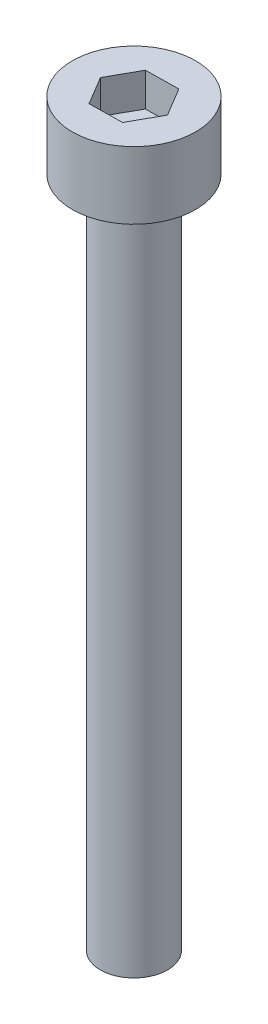
ISO-10303-21;
HEADER;
FILE_DESCRIPTION(('STEP AP214'),'2;1');
FILE_NAME('part.step','',(''),(''),'','','');
FILE_SCHEMA(('AUTOMOTIVE_DESIGN { 1 0 10303 214 1 1 1 1 }'));
ENDSEC;
DATA;
#1=APPLICATION_CONTEXT('core data for automotive mechanical design processes');
#2=APPLICATION_PROTOCOL_DEFINITION('international standard','automotive_design',2000,#1);
#3=PRODUCT_CONTEXT('',#1,'mechanical');
#4=PRODUCT('Part','Part','',(#3));
#5=PRODUCT_RELATED_PRODUCT_CATEGORY('part','',(#4));
#6=PRODUCT_DEFINITION_FORMATION('','',#4);
#7=PRODUCT_DEFINITION_CONTEXT('part definition',#1,'design');
#8=PRODUCT_DEFINITION('design','',#6,#7);
#9=PRODUCT_DEFINITION_SHAPE('','',#8);
#10=(LENGTH_UNIT() NAMED_UNIT(*) SI_UNIT(.MILLI.,.METRE.));
#11=(NAMED_UNIT(*) PLANE_ANGLE_UNIT() SI_UNIT($,.RADIAN.));
#12=(NAMED_UNIT(*) SI_UNIT($,.STERADIAN.) SOLID_ANGLE_UNIT());
#13=UNCERTAINTY_MEASURE_WITH_UNIT(LENGTH_MEASURE(1.E-05),#10,'distance_accuracy_value','');
#14=(GEOMETRIC_REPRESENTATION_CONTEXT(3) GLOBAL_UNCERTAINTY_ASSIGNED_CONTEXT((#13)) GLOBAL_UNIT_ASSIGNED_CONTEXT((#10,
#11,#12)) REPRESENTATION_CONTEXT('',''));
#15=CARTESIAN_POINT('',(0.,0.,0.));
#16=DIRECTION('',(0.,0.,1.));
#17=DIRECTION('',(1.,0.,0.));
#18=AXIS2_PLACEMENT_3D('',#15,#16,#17);
#19=CARTESIAN_POINT('',(0.,30.,0.));
#20=DIRECTION('',(0.,-1.,0.));
#21=DIRECTION('',(0.,0.,-1.));
#22=AXIS2_PLACEMENT_3D('',#19,#20,#21);
#23=CYLINDRICAL_SURFACE('',#22,1.5);
#24=CARTESIAN_POINT('',(0.,30.,0.));
#25=DIRECTION('',(0.,1.,0.));
#26=DIRECTION('',(0.,0.,1.));
#27=AXIS2_PLACEMENT_3D('',#24,#25,#26);
#28=CIRCLE('',#27,1.5);
#29=CARTESIAN_POINT('',(0.,30.,1.5));
#30=VERTEX_POINT('',#29);
#31=EDGE_CURVE('E11',#30,#30,#28,.T.);
#32=ORIENTED_EDGE('',*,*,#31,.F.);
#33=EDGE_LOOP('',(#32));
#34=FACE_BOUND('',#33,.T.);
#35=CARTESIAN_POINT('',(0.,0.,0.));
#36=DIRECTION('',(0.,1.,0.));
#37=DIRECTION('',(0.,0.,1.));
#38=AXIS2_PLACEMENT_3D('',#35,#36,#37);
#39=CIRCLE('',#38,1.5);
#40=CARTESIAN_POINT('',(0.,0.,1.5));
#41=VERTEX_POINT('',#40);
#42=EDGE_CURVE('E24',#41,#41,#39,.T.);
#43=ORIENTED_EDGE('',*,*,#42,.T.);
#44=EDGE_LOOP('',(#43));
#45=FACE_BOUND('',#44,.T.);
#46=ADVANCED_FACE('F17',(#34,#45),#23,.T.);
#47=CARTESIAN_POINT('',(0.,0.,0.));
#48=DIRECTION('',(0.,1.,0.));
#49=DIRECTION('',(0.,0.,1.));
#50=AXIS2_PLACEMENT_3D('',#47,#48,#49);
#51=PLANE('',#50);
#52=ORIENTED_EDGE('',*,*,#42,.F.);
#53=EDGE_LOOP('',(#52));
#54=FACE_BOUND('',#53,.T.);
#55=ADVANCED_FACE('F132',(#54),#51,.F.);
#56=CARTESIAN_POINT('',(0.,33.,0.));
#57=DIRECTION('',(0.,-1.,0.));
#58=DIRECTION('',(0.,0.,-1.));
#59=AXIS2_PLACEMENT_3D('',#56,#57,#58);
#60=CYLINDRICAL_SURFACE('',#59,2.75);
#61=CARTESIAN_POINT('',(0.,33.,0.));
#62=DIRECTION('',(0.,1.,0.));
#63=DIRECTION('',(0.,0.,1.));
#64=AXIS2_PLACEMENT_3D('',#61,#62,#63);
#65=CIRCLE('',#64,2.75);
#66=CARTESIAN_POINT('',(0.,33.,2.75));
#67=VERTEX_POINT('',#66);
#68=EDGE_CURVE('E126',#67,#67,#65,.T.);
#69=ORIENTED_EDGE('',*,*,#68,.F.);
#70=EDGE_LOOP('',(#69));
#71=FACE_BOUND('',#70,.T.);
#72=CARTESIAN_POINT('',(0.,30.,0.));
#73=DIRECTION('',(0.,1.,0.));
#74=DIRECTION('',(0.,0.,1.));
#75=AXIS2_PLACEMENT_3D('',#72,#73,#74);
#76=CIRCLE('',#75,2.75);
#77=CARTESIAN_POINT('',(0.,30.,2.75));
#78=VERTEX_POINT('',#77);
#79=EDGE_CURVE('E123',#78,#78,#76,.T.);
#80=ORIENTED_EDGE('',*,*,#79,.T.);
#81=EDGE_LOOP('',(#80));
#82=FACE_BOUND('',#81,.T.);
#83=ADVANCED_FACE('F134',(#71,#82),#60,.T.);
#84=CARTESIAN_POINT('',(0.,33.,0.));
#85=DIRECTION('',(0.,1.,0.));
#86=DIRECTION('',(0.,0.,1.));
#87=AXIS2_PLACEMENT_3D('',#84,#85,#86);
#88=PLANE('',#87);
#89=DIRECTION('',(0.999893086922528,0.,-0.0146224048821464));
#90=VECTOR('',#89,1.);
#91=CARTESIAN_POINT('',(-0.717399325967113,33.,1.28562755380473));
#92=LINE('',#91,#90);
#93=CARTESIAN_POINT('',(-0.717399325967113,33.,1.28562755380473));
#94=VERTEX_POINT('',#93);
#95=CARTESIAN_POINT('',(0.754686458416585,33.,1.26409981784772));
#96=VERTEX_POINT('',#95);
#97=EDGE_CURVE('E31',#94,#96,#92,.T.);
#98=ORIENTED_EDGE('',*,*,#97,.F.);
#99=DIRECTION('',(0.512609917553624,0.,0.858621611902278));
#100=VECTOR('',#99,1.);
#101=CARTESIAN_POINT('',(-1.4720857843837,33.,0.0215277359570126));
#102=LINE('',#101,#100);
#103=CARTESIAN_POINT('',(-1.4720857843837,33.,0.0215277359570126));
#104=VERTEX_POINT('',#103);
#105=EDGE_CURVE('E36',#104,#94,#102,.T.);
#106=ORIENTED_EDGE('',*,*,#105,.F.);
#107=DIRECTION('',(-0.487283169368904,0.,0.873244016784424));
#108=VECTOR('',#107,1.);
#109=CARTESIAN_POINT('',(-0.754686458416585,33.,-1.26409981784772));
#110=LINE('',#109,#108);
#111=CARTESIAN_POINT('',(-0.754686458416585,33.,-1.26409981784772));
#112=VERTEX_POINT('',#111);
#113=EDGE_CURVE('E118',#112,#104,#110,.T.);
#114=ORIENTED_EDGE('',*,*,#113,.F.);
#115=DIRECTION('',(-0.999893086922528,0.,0.0146224048821461));
#116=VECTOR('',#115,1.);
#117=CARTESIAN_POINT('',(0.717399325967112,33.,-1.28562755380473));
#118=LINE('',#117,#116);
#119=CARTESIAN_POINT('',(0.717399325967112,33.,-1.28562755380473));
#120=VERTEX_POINT('',#119);
#121=EDGE_CURVE('E115',#120,#112,#118,.T.);
#122=ORIENTED_EDGE('',*,*,#121,.F.);
#123=DIRECTION('',(-0.512609917553624,0.,-0.858621611902278));
#124=VECTOR('',#123,1.);
#125=CARTESIAN_POINT('',(1.4720857843837,33.,-0.0215277359570131));
#126=LINE('',#125,#124);
#127=CARTESIAN_POINT('',(1.4720857843837,33.,-0.0215277359570131));
#128=VERTEX_POINT('',#127);
#129=EDGE_CURVE('E113',#128,#120,#126,.T.);
#130=ORIENTED_EDGE('',*,*,#129,.F.);
#131=DIRECTION('',(0.487283169368904,0.,-0.873244016784425));
#132=VECTOR('',#131,1.);
#133=CARTESIAN_POINT('',(0.754686458416585,33.,1.26409981784772));
#134=LINE('',#133,#132);
#135=EDGE_CURVE('E87',#96,#128,#134,.T.);
#136=ORIENTED_EDGE('',*,*,#135,.F.);
#137=EDGE_LOOP('',(#98,#106,#114,#122,#130,#136));
#138=FACE_BOUND('',#137,.T.);
#139=ORIENTED_EDGE('',*,*,#68,.T.);
#140=EDGE_LOOP('',(#139));
#141=FACE_BOUND('',#140,.T.);
#142=ADVANCED_FACE('F140',(#138,#141),#88,.T.);
#143=CARTESIAN_POINT('',(0.,30.,0.));
#144=DIRECTION('',(0.,1.,0.));
#145=DIRECTION('',(0.,0.,1.));
#146=AXIS2_PLACEMENT_3D('',#143,#144,#145);
#147=PLANE('',#146);
#148=ORIENTED_EDGE('',*,*,#31,.T.);
#149=EDGE_LOOP('',(#148));
#150=FACE_BOUND('',#149,.T.);
#151=ORIENTED_EDGE('',*,*,#79,.F.);
#152=EDGE_LOOP('',(#151));
#153=FACE_BOUND('',#152,.T.);
#154=ADVANCED_FACE('F147',(#150,#153),#147,.F.);
#155=CARTESIAN_POINT('',(-0.717399325967113,31.5,1.28562755380473));
#156=DIRECTION('',(0.0146224048821464,0.,0.999893086922528));
#157=DIRECTION('',(0.999893086922528,0.,-0.0146224048821464));
#158=AXIS2_PLACEMENT_3D('',#155,#156,#157);
#159=PLANE('',#158);
#160=ORIENTED_EDGE('',*,*,#97,.T.);
#161=DIRECTION('',(0.,1.,0.));
#162=VECTOR('',#161,1.);
#163=CARTESIAN_POINT('',(0.754686458416585,31.5,1.26409981784772));
#164=LINE('',#163,#162);
#165=CARTESIAN_POINT('',(0.754686458416585,31.5,1.26409981784772));
#166=VERTEX_POINT('',#165);
#167=EDGE_CURVE('E110',#166,#96,#164,.T.);
#168=ORIENTED_EDGE('',*,*,#167,.F.);
#169=DIRECTION('',(0.999893086922528,0.,-0.0146224048821464));
#170=VECTOR('',#169,1.);
#171=CARTESIAN_POINT('',(-0.717399325967113,31.5,1.28562755380473));
#172=LINE('',#171,#170);
#173=CARTESIAN_POINT('',(-0.717399325967113,31.5,1.28562755380473));
#174=VERTEX_POINT('',#173);
#175=EDGE_CURVE('E91',#174,#166,#172,.T.);
#176=ORIENTED_EDGE('',*,*,#175,.F.);
#177=DIRECTION('',(0.,1.,0.));
#178=VECTOR('',#177,1.);
#179=CARTESIAN_POINT('',(-0.717399325967113,31.5,1.28562755380473));
#180=LINE('',#179,#178);
#181=EDGE_CURVE('E107',#174,#94,#180,.T.);
#182=ORIENTED_EDGE('',*,*,#181,.T.);
#183=EDGE_LOOP('',(#160,#168,#176,#182));
#184=FACE_BOUND('',#183,.T.);
#185=ADVANCED_FACE('F150',(#184),#159,.F.);
#186=CARTESIAN_POINT('',(-1.4720857843837,31.5,0.0215277359570126));
#187=DIRECTION('',(-0.858621611902278,0.,0.512609917553624));
#188=DIRECTION('',(0.512609917553624,0.,0.858621611902278));
#189=AXIS2_PLACEMENT_3D('',#186,#187,#188);
#190=PLANE('',#189);
#191=ORIENTED_EDGE('',*,*,#105,.T.);
#192=ORIENTED_EDGE('',*,*,#181,.F.);
#193=DIRECTION('',(0.512609917553624,0.,0.858621611902278));
#194=VECTOR('',#193,1.);
#195=CARTESIAN_POINT('',(-1.4720857843837,31.5,0.0215277359570126));
#196=LINE('',#195,#194);
#197=CARTESIAN_POINT('',(-1.4720857843837,31.5,0.0215277359570126));
#198=VERTEX_POINT('',#197);
#199=EDGE_CURVE('E105',#198,#174,#196,.T.);
#200=ORIENTED_EDGE('',*,*,#199,.F.);
#201=DIRECTION('',(0.,1.,0.));
#202=VECTOR('',#201,1.);
#203=CARTESIAN_POINT('',(-1.4720857843837,31.5,0.0215277359570126));
#204=LINE('',#203,#202);
#205=EDGE_CURVE('E103',#198,#104,#204,.T.);
#206=ORIENTED_EDGE('',*,*,#205,.T.);
#207=EDGE_LOOP('',(#191,#192,#200,#206));
#208=FACE_BOUND('',#207,.T.);
#209=ADVANCED_FACE('F154',(#208),#190,.F.);
#210=CARTESIAN_POINT('',(-0.754686458416585,31.5,-1.26409981784772));
#211=DIRECTION('',(-0.873244016784425,0.,-0.487283169368904));
#212=DIRECTION('',(-0.487283169368904,0.,0.873244016784425));
#213=AXIS2_PLACEMENT_3D('',#210,#211,#212);
#214=PLANE('',#213);
#215=ORIENTED_EDGE('',*,*,#113,.T.);
#216=ORIENTED_EDGE('',*,*,#205,.F.);
#217=DIRECTION('',(-0.487283169368904,0.,0.873244016784424));
#218=VECTOR('',#217,1.);
#219=CARTESIAN_POINT('',(-0.754686458416585,31.5,-1.26409981784772));
#220=LINE('',#219,#218);
#221=CARTESIAN_POINT('',(-0.754686458416585,31.5,-1.26409981784772));
#222=VERTEX_POINT('',#221);
#223=EDGE_CURVE('E100',#222,#198,#220,.T.);
#224=ORIENTED_EDGE('',*,*,#223,.F.);
#225=DIRECTION('',(0.,1.,0.));
#226=VECTOR('',#225,1.);
#227=CARTESIAN_POINT('',(-0.754686458416585,31.5,-1.26409981784772));
#228=LINE('',#227,#226);
#229=EDGE_CURVE('E97',#222,#112,#228,.T.);
#230=ORIENTED_EDGE('',*,*,#229,.T.);
#231=EDGE_LOOP('',(#215,#216,#224,#230));
#232=FACE_BOUND('',#231,.T.);
#233=ADVANCED_FACE('F158',(#232),#214,.F.);
#234=CARTESIAN_POINT('',(0.717399325967112,31.5,-1.28562755380473));
#235=DIRECTION('',(-0.0146224048821461,0.,-0.999893086922528));
#236=DIRECTION('',(-0.999893086922528,0.,0.0146224048821461));
#237=AXIS2_PLACEMENT_3D('',#234,#235,#236);
#238=PLANE('',#237);
#239=ORIENTED_EDGE('',*,*,#121,.T.);
#240=ORIENTED_EDGE('',*,*,#229,.F.);
#241=DIRECTION('',(-0.999893086922528,0.,0.0146224048821461));
#242=VECTOR('',#241,1.);
#243=CARTESIAN_POINT('',(0.717399325967112,31.5,-1.28562755380473));
#244=LINE('',#243,#242);
#245=CARTESIAN_POINT('',(0.717399325967112,31.5,-1.28562755380473));
#246=VERTEX_POINT('',#245);
#247=EDGE_CURVE('E95',#246,#222,#244,.T.);
#248=ORIENTED_EDGE('',*,*,#247,.F.);
#249=DIRECTION('',(0.,1.,0.));
#250=VECTOR('',#249,1.);
#251=CARTESIAN_POINT('',(0.717399325967112,31.5,-1.28562755380473));
#252=LINE('',#251,#250);
#253=EDGE_CURVE('E76',#246,#120,#252,.T.);
#254=ORIENTED_EDGE('',*,*,#253,.T.);
#255=EDGE_LOOP('',(#239,#240,#248,#254));
#256=FACE_BOUND('',#255,.T.);
#257=ADVANCED_FACE('F162',(#256),#238,.F.);
#258=CARTESIAN_POINT('',(1.4720857843837,31.5,-0.0215277359570131));
#259=DIRECTION('',(0.858621611902278,0.,-0.512609917553624));
#260=DIRECTION('',(-0.512609917553624,0.,-0.858621611902278));
#261=AXIS2_PLACEMENT_3D('',#258,#259,#260);
#262=PLANE('',#261);
#263=ORIENTED_EDGE('',*,*,#129,.T.);
#264=ORIENTED_EDGE('',*,*,#253,.F.);
#265=DIRECTION('',(-0.512609917553624,0.,-0.858621611902278));
#266=VECTOR('',#265,1.);
#267=CARTESIAN_POINT('',(1.4720857843837,31.5,-0.0215277359570131));
#268=LINE('',#267,#266);
#269=CARTESIAN_POINT('',(1.4720857843837,31.5,-0.0215277359570131));
#270=VERTEX_POINT('',#269);
#271=EDGE_CURVE('E69',#270,#246,#268,.T.);
#272=ORIENTED_EDGE('',*,*,#271,.F.);
#273=DIRECTION('',(0.,1.,0.));
#274=VECTOR('',#273,1.);
#275=CARTESIAN_POINT('',(1.4720857843837,31.5,-0.0215277359570131));
#276=LINE('',#275,#274);
#277=EDGE_CURVE('E73',#270,#128,#276,.T.);
#278=ORIENTED_EDGE('',*,*,#277,.T.);
#279=EDGE_LOOP('',(#263,#264,#272,#278));
#280=FACE_BOUND('',#279,.T.);
#281=ADVANCED_FACE('F72',(#280),#262,.F.);
#282=CARTESIAN_POINT('',(0.754686458416585,31.5,1.26409981784772));
#283=DIRECTION('',(0.873244016784425,0.,0.487283169368904));
#284=DIRECTION('',(0.487283169368904,0.,-0.873244016784425));
#285=AXIS2_PLACEMENT_3D('',#282,#283,#284);
#286=PLANE('',#285);
#287=ORIENTED_EDGE('',*,*,#135,.T.);
#288=ORIENTED_EDGE('',*,*,#277,.F.);
#289=DIRECTION('',(0.487283169368904,0.,-0.873244016784425));
#290=VECTOR('',#289,1.);
#291=CARTESIAN_POINT('',(0.754686458416585,31.5,1.26409981784772));
#292=LINE('',#291,#290);
#293=EDGE_CURVE('E85',#166,#270,#292,.T.);
#294=ORIENTED_EDGE('',*,*,#293,.F.);
#295=ORIENTED_EDGE('',*,*,#167,.T.);
#296=EDGE_LOOP('',(#287,#288,#294,#295));
#297=FACE_BOUND('',#296,.T.);
#298=ADVANCED_FACE('F83',(#297),#286,.F.);
#299=CARTESIAN_POINT('',(0.,31.5,0.));
#300=DIRECTION('',(0.,1.,0.));
#301=DIRECTION('',(0.,0.,1.));
#302=AXIS2_PLACEMENT_3D('',#299,#300,#301);
#303=PLANE('',#302);
#304=ORIENTED_EDGE('',*,*,#175,.T.);
#305=ORIENTED_EDGE('',*,*,#293,.T.);
#306=ORIENTED_EDGE('',*,*,#271,.T.);
#307=ORIENTED_EDGE('',*,*,#247,.T.);
#308=ORIENTED_EDGE('',*,*,#223,.T.);
#309=ORIENTED_EDGE('',*,*,#199,.T.);
#310=EDGE_LOOP('',(#304,#305,#306,#307,#308,#309));
#311=FACE_BOUND('',#310,.T.);
#312=ADVANCED_FACE('F89',(#311),#303,.T.);
#313=CLOSED_SHELL('',(#46,#55,#83,#142,#154,#185,#209,#233,#257,#281,#298,#312));
#314=MANIFOLD_SOLID_BREP('B1',#313);
#315=ADVANCED_BREP_SHAPE_REPRESENTATION('',(#18,#314),#14);
#316=SHAPE_DEFINITION_REPRESENTATION(#9,#315);
ENDSEC;
END-ISO-10303-21;
